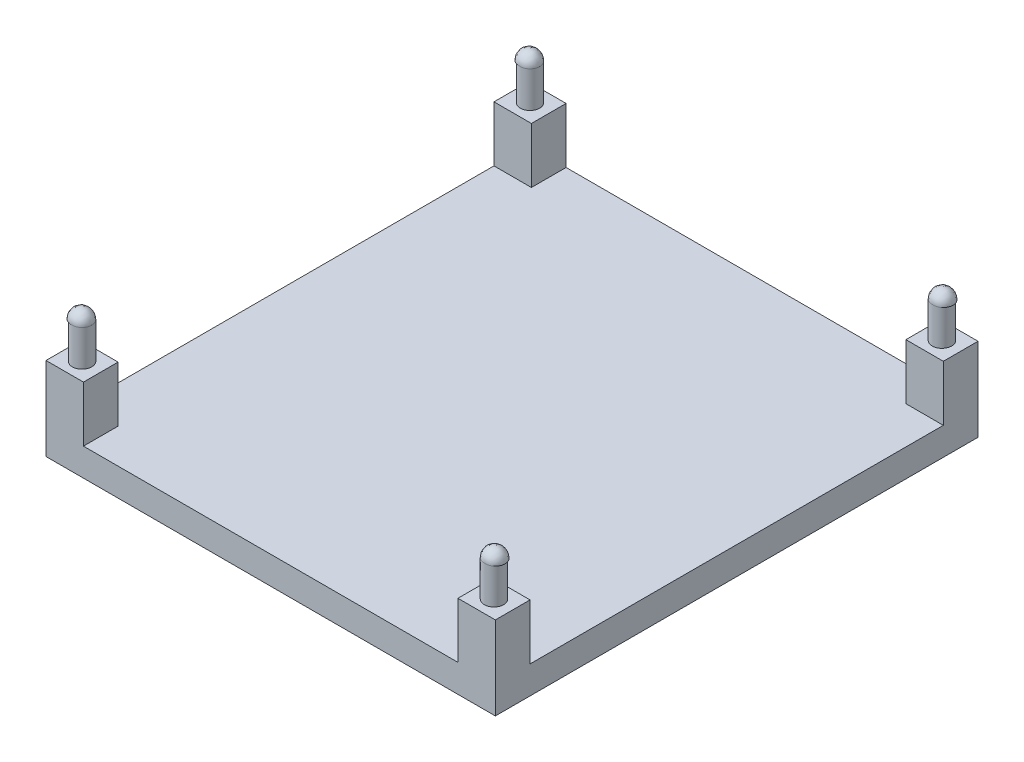
ISO-10303-21;
HEADER;
FILE_DESCRIPTION(('STEP AP214'),'2;1');
FILE_NAME('part.step','',(''),(''),'','','');
FILE_SCHEMA(('AUTOMOTIVE_DESIGN { 1 0 10303 214 1 1 1 1 }'));
ENDSEC;
DATA;
#1=APPLICATION_CONTEXT('core data for automotive mechanical design processes');
#2=APPLICATION_PROTOCOL_DEFINITION('international standard','automotive_design',2000,#1);
#3=PRODUCT_CONTEXT('',#1,'mechanical');
#4=PRODUCT('Part','Part','',(#3));
#5=PRODUCT_RELATED_PRODUCT_CATEGORY('part','',(#4));
#6=PRODUCT_DEFINITION_FORMATION('','',#4);
#7=PRODUCT_DEFINITION_CONTEXT('part definition',#1,'design');
#8=PRODUCT_DEFINITION('design','',#6,#7);
#9=PRODUCT_DEFINITION_SHAPE('','',#8);
#10=(LENGTH_UNIT() NAMED_UNIT(*) SI_UNIT(.MILLI.,.METRE.));
#11=(NAMED_UNIT(*) PLANE_ANGLE_UNIT() SI_UNIT($,.RADIAN.));
#12=(NAMED_UNIT(*) SI_UNIT($,.STERADIAN.) SOLID_ANGLE_UNIT());
#13=UNCERTAINTY_MEASURE_WITH_UNIT(LENGTH_MEASURE(1.E-05),#10,'distance_accuracy_value','');
#14=(GEOMETRIC_REPRESENTATION_CONTEXT(3) GLOBAL_UNCERTAINTY_ASSIGNED_CONTEXT((#13)) GLOBAL_UNIT_ASSIGNED_CONTEXT((#10,
#11,#12)) REPRESENTATION_CONTEXT('',''));
#15=CARTESIAN_POINT('',(0.,0.,0.));
#16=DIRECTION('',(0.,0.,1.));
#17=DIRECTION('',(1.,0.,0.));
#18=AXIS2_PLACEMENT_3D('',#15,#16,#17);
#19=CARTESIAN_POINT('',(0.,5.08,0.));
#20=DIRECTION('',(0.,-1.,0.));
#21=DIRECTION('',(0.,0.,-1.));
#22=AXIS2_PLACEMENT_3D('',#19,#20,#21);
#23=PLANE('',#22);
#24=DIRECTION('',(-1.,0.,0.));
#25=VECTOR('',#24,1.);
#26=CARTESIAN_POINT('',(-34.2899999999991,5.08,37.846));
#27=LINE('',#26,#25);
#28=CARTESIAN_POINT('',(-34.2899999999991,5.08,37.846));
#29=VERTEX_POINT('',#28);
#30=CARTESIAN_POINT('',(-41.148,5.08,37.846));
#31=VERTEX_POINT('',#30);
#32=EDGE_CURVE('E58',#29,#31,#27,.T.);
#33=ORIENTED_EDGE('',*,*,#32,.F.);
#34=DIRECTION('',(0.,0.,-1.));
#35=VECTOR('',#34,1.);
#36=CARTESIAN_POINT('',(-34.2899999999991,5.08,44.1959999999999));
#37=LINE('',#36,#35);
#38=CARTESIAN_POINT('',(-34.2899999999991,5.08,44.196));
#39=VERTEX_POINT('',#38);
#40=EDGE_CURVE('E62',#39,#29,#37,.T.);
#41=ORIENTED_EDGE('',*,*,#40,.F.);
#42=DIRECTION('',(1.,0.,0.));
#43=VECTOR('',#42,1.);
#44=CARTESIAN_POINT('',(-41.148,5.08,44.196));
#45=LINE('',#44,#43);
#46=CARTESIAN_POINT('',(34.2899999999991,5.08,44.1959999999999));
#47=VERTEX_POINT('',#46);
#48=EDGE_CURVE('E409',#39,#47,#45,.T.);
#49=ORIENTED_EDGE('',*,*,#48,.T.);
#50=DIRECTION('',(0.,0.,1.));
#51=VECTOR('',#50,1.);
#52=CARTESIAN_POINT('',(34.2899999999991,5.08,44.1959999999999));
#53=LINE('',#52,#51);
#54=CARTESIAN_POINT('',(34.2899999999991,5.08,37.846));
#55=VERTEX_POINT('',#54);
#56=EDGE_CURVE('E253',#55,#47,#53,.T.);
#57=ORIENTED_EDGE('',*,*,#56,.F.);
#58=DIRECTION('',(-1.,0.,0.));
#59=VECTOR('',#58,1.);
#60=CARTESIAN_POINT('',(34.2899999999991,5.08,37.846));
#61=LINE('',#60,#59);
#62=CARTESIAN_POINT('',(41.1479999999991,5.08,37.846));
#63=VERTEX_POINT('',#62);
#64=EDGE_CURVE('E251',#63,#55,#61,.T.);
#65=ORIENTED_EDGE('',*,*,#64,.F.);
#66=DIRECTION('',(0.,0.,1.));
#67=VECTOR('',#66,1.);
#68=CARTESIAN_POINT('',(41.148,5.08,-44.196));
#69=LINE('',#68,#67);
#70=CARTESIAN_POINT('',(41.148,5.08,-37.846));
#71=VERTEX_POINT('',#70);
#72=EDGE_CURVE('E406',#71,#63,#69,.T.);
#73=ORIENTED_EDGE('',*,*,#72,.F.);
#74=DIRECTION('',(1.,0.,0.));
#75=VECTOR('',#74,1.);
#76=CARTESIAN_POINT('',(34.29,5.08,-37.8460000000001));
#77=LINE('',#76,#75);
#78=CARTESIAN_POINT('',(34.29,5.08,-37.8460000000001));
#79=VERTEX_POINT('',#78);
#80=EDGE_CURVE('E226',#79,#71,#77,.T.);
#81=ORIENTED_EDGE('',*,*,#80,.F.);
#82=DIRECTION('',(0.,0.,1.));
#83=VECTOR('',#82,1.);
#84=CARTESIAN_POINT('',(34.29,5.08,-37.8460000000001));
#85=LINE('',#84,#83);
#86=CARTESIAN_POINT('',(34.29,5.08,-44.196));
#87=VERTEX_POINT('',#86);
#88=EDGE_CURVE('E228',#87,#79,#85,.T.);
#89=ORIENTED_EDGE('',*,*,#88,.F.);
#90=DIRECTION('',(1.,0.,0.));
#91=VECTOR('',#90,1.);
#92=CARTESIAN_POINT('',(-41.148,5.08,-44.196));
#93=LINE('',#92,#91);
#94=CARTESIAN_POINT('',(-34.29,5.08,-44.196));
#95=VERTEX_POINT('',#94);
#96=EDGE_CURVE('E403',#95,#87,#93,.T.);
#97=ORIENTED_EDGE('',*,*,#96,.F.);
#98=DIRECTION('',(0.,0.,-1.));
#99=VECTOR('',#98,1.);
#100=CARTESIAN_POINT('',(-34.29,5.08,-37.8460000000001));
#101=LINE('',#100,#99);
#102=CARTESIAN_POINT('',(-34.29,5.08,-37.8460000000001));
#103=VERTEX_POINT('',#102);
#104=EDGE_CURVE('E270',#103,#95,#101,.T.);
#105=ORIENTED_EDGE('',*,*,#104,.F.);
#106=DIRECTION('',(1.,0.,0.));
#107=VECTOR('',#106,1.);
#108=CARTESIAN_POINT('',(-34.29,5.08,-37.8460000000001));
#109=LINE('',#108,#107);
#110=CARTESIAN_POINT('',(-41.148,5.08,-37.846));
#111=VERTEX_POINT('',#110);
#112=EDGE_CURVE('E257',#111,#103,#109,.T.);
#113=ORIENTED_EDGE('',*,*,#112,.F.);
#114=DIRECTION('',(0.,0.,1.));
#115=VECTOR('',#114,1.);
#116=CARTESIAN_POINT('',(-41.148,5.08,-44.196));
#117=LINE('',#116,#115);
#118=EDGE_CURVE('E411',#111,#31,#117,.T.);
#119=ORIENTED_EDGE('',*,*,#118,.T.);
#120=EDGE_LOOP('',(#33,#41,#49,#57,#65,#73,#81,#89,#97,#105,#113,#119));
#121=FACE_BOUND('',#120,.T.);
#122=ADVANCED_FACE('F41',(#121),#23,.F.);
#123=CARTESIAN_POINT('',(-41.148,5.08,44.196));
#124=DIRECTION('',(0.,0.,-1.));
#125=DIRECTION('',(-1.,0.,0.));
#126=AXIS2_PLACEMENT_3D('',#123,#124,#125);
#127=PLANE('',#126);
#128=DIRECTION('',(1.,0.,0.));
#129=VECTOR('',#128,1.);
#130=CARTESIAN_POINT('',(-41.148,0.,44.196));
#131=LINE('',#130,#129);
#132=CARTESIAN_POINT('',(-41.148,0.,44.196));
#133=VERTEX_POINT('',#132);
#134=CARTESIAN_POINT('',(41.148,0.,44.196));
#135=VERTEX_POINT('',#134);
#136=EDGE_CURVE('E417',#133,#135,#131,.T.);
#137=ORIENTED_EDGE('',*,*,#136,.T.);
#138=DIRECTION('',(0.,-1.,0.));
#139=VECTOR('',#138,1.);
#140=CARTESIAN_POINT('',(41.148,5.08,44.196));
#141=LINE('',#140,#139);
#142=CARTESIAN_POINT('',(41.1479999999991,15.24,44.196));
#143=VERTEX_POINT('',#142);
#144=EDGE_CURVE('E431',#143,#135,#141,.T.);
#145=ORIENTED_EDGE('',*,*,#144,.F.);
#146=DIRECTION('',(1.,0.,0.));
#147=VECTOR('',#146,1.);
#148=CARTESIAN_POINT('',(34.2899999999991,15.24,44.1959999999999));
#149=LINE('',#148,#147);
#150=CARTESIAN_POINT('',(34.2899999999991,15.24,44.1959999999999));
#151=VERTEX_POINT('',#150);
#152=EDGE_CURVE('E261',#151,#143,#149,.T.);
#153=ORIENTED_EDGE('',*,*,#152,.F.);
#154=DIRECTION('',(0.,-1.,0.));
#155=VECTOR('',#154,1.);
#156=CARTESIAN_POINT('',(34.2899999999991,15.24,44.1959999999999));
#157=LINE('',#156,#155);
#158=EDGE_CURVE('E241',#151,#47,#157,.T.);
#159=ORIENTED_EDGE('',*,*,#158,.T.);
#160=ORIENTED_EDGE('',*,*,#48,.F.);
#161=DIRECTION('',(0.,-1.,0.));
#162=VECTOR('',#161,1.);
#163=CARTESIAN_POINT('',(-34.2899999999991,15.24,44.1959999999999));
#164=LINE('',#163,#162);
#165=CARTESIAN_POINT('',(-34.2899999999991,15.24,44.1959999999999));
#166=VERTEX_POINT('',#165);
#167=EDGE_CURVE('E207',#166,#39,#164,.T.);
#168=ORIENTED_EDGE('',*,*,#167,.F.);
#169=DIRECTION('',(1.,0.,0.));
#170=VECTOR('',#169,1.);
#171=CARTESIAN_POINT('',(-34.2899999999991,15.24,44.1959999999999));
#172=LINE('',#171,#170);
#173=CARTESIAN_POINT('',(-41.1479999999992,15.24,44.196));
#174=VERTEX_POINT('',#173);
#175=EDGE_CURVE('E198',#174,#166,#172,.T.);
#176=ORIENTED_EDGE('',*,*,#175,.F.);
#177=DIRECTION('',(0.,-1.,0.));
#178=VECTOR('',#177,1.);
#179=CARTESIAN_POINT('',(-41.148,5.08,44.196));
#180=LINE('',#179,#178);
#181=EDGE_CURVE('E416',#174,#133,#180,.T.);
#182=ORIENTED_EDGE('',*,*,#181,.T.);
#183=EDGE_LOOP('',(#137,#145,#153,#159,#160,#168,#176,#182));
#184=FACE_BOUND('',#183,.T.);
#185=ADVANCED_FACE('F492',(#184),#127,.F.);
#186=CARTESIAN_POINT('',(41.148,5.08,-44.196));
#187=DIRECTION('',(1.,0.,0.));
#188=DIRECTION('',(0.,0.,-1.));
#189=AXIS2_PLACEMENT_3D('',#186,#187,#188);
#190=PLANE('',#189);
#191=DIRECTION('',(0.,0.,1.));
#192=VECTOR('',#191,1.);
#193=CARTESIAN_POINT('',(41.148,0.,-44.196));
#194=LINE('',#193,#192);
#195=CARTESIAN_POINT('',(41.148,0.,-44.196));
#196=VERTEX_POINT('',#195);
#197=EDGE_CURVE('E420',#196,#135,#194,.T.);
#198=ORIENTED_EDGE('',*,*,#197,.F.);
#199=DIRECTION('',(0.,-1.,0.));
#200=VECTOR('',#199,1.);
#201=CARTESIAN_POINT('',(41.148,5.08,-44.196));
#202=LINE('',#201,#200);
#203=CARTESIAN_POINT('',(41.148,15.24,-44.196));
#204=VERTEX_POINT('',#203);
#205=EDGE_CURVE('E397',#204,#196,#202,.T.);
#206=ORIENTED_EDGE('',*,*,#205,.F.);
#207=DIRECTION('',(0.,0.,-1.));
#208=VECTOR('',#207,1.);
#209=CARTESIAN_POINT('',(41.148,15.24,-37.846));
#210=LINE('',#209,#208);
#211=CARTESIAN_POINT('',(41.148,15.24,-37.846));
#212=VERTEX_POINT('',#211);
#213=EDGE_CURVE('E234',#212,#204,#210,.T.);
#214=ORIENTED_EDGE('',*,*,#213,.F.);
#215=DIRECTION('',(0.,-1.,0.));
#216=VECTOR('',#215,1.);
#217=CARTESIAN_POINT('',(41.148,15.24,-37.846));
#218=LINE('',#217,#216);
#219=EDGE_CURVE('E220',#212,#71,#218,.T.);
#220=ORIENTED_EDGE('',*,*,#219,.T.);
#221=ORIENTED_EDGE('',*,*,#72,.T.);
#222=DIRECTION('',(0.,-1.,0.));
#223=VECTOR('',#222,1.);
#224=CARTESIAN_POINT('',(41.1479999999991,15.24,37.846));
#225=LINE('',#224,#223);
#226=CARTESIAN_POINT('',(41.1479999999991,15.24,37.846));
#227=VERTEX_POINT('',#226);
#228=EDGE_CURVE('E244',#227,#63,#225,.T.);
#229=ORIENTED_EDGE('',*,*,#228,.F.);
#230=DIRECTION('',(0.,0.,-1.));
#231=VECTOR('',#230,1.);
#232=CARTESIAN_POINT('',(41.1479999999991,15.24,44.196));
#233=LINE('',#232,#231);
#234=EDGE_CURVE('E259',#143,#227,#233,.T.);
#235=ORIENTED_EDGE('',*,*,#234,.F.);
#236=ORIENTED_EDGE('',*,*,#144,.T.);
#237=EDGE_LOOP('',(#198,#206,#214,#220,#221,#229,#235,#236));
#238=FACE_BOUND('',#237,.T.);
#239=ADVANCED_FACE('F396',(#238),#190,.T.);
#240=CARTESIAN_POINT('',(-41.148,5.08,-44.196));
#241=DIRECTION('',(0.,0.,-1.));
#242=DIRECTION('',(-1.,0.,0.));
#243=AXIS2_PLACEMENT_3D('',#240,#241,#242);
#244=PLANE('',#243);
#245=DIRECTION('',(1.,0.,0.));
#246=VECTOR('',#245,1.);
#247=CARTESIAN_POINT('',(-41.148,0.,-44.196));
#248=LINE('',#247,#246);
#249=CARTESIAN_POINT('',(-41.148,0.,-44.196));
#250=VERTEX_POINT('',#249);
#251=EDGE_CURVE('E423',#250,#196,#248,.T.);
#252=ORIENTED_EDGE('',*,*,#251,.F.);
#253=DIRECTION('',(0.,-1.,0.));
#254=VECTOR('',#253,1.);
#255=CARTESIAN_POINT('',(-41.148,5.08,-44.196));
#256=LINE('',#255,#254);
#257=CARTESIAN_POINT('',(-41.148,15.24,-44.196));
#258=VERTEX_POINT('',#257);
#259=EDGE_CURVE('E429',#258,#250,#256,.T.);
#260=ORIENTED_EDGE('',*,*,#259,.F.);
#261=DIRECTION('',(-1.,0.,0.));
#262=VECTOR('',#261,1.);
#263=CARTESIAN_POINT('',(-34.29,15.24,-44.196));
#264=LINE('',#263,#262);
#265=CARTESIAN_POINT('',(-34.29,15.24,-44.196));
#266=VERTEX_POINT('',#265);
#267=EDGE_CURVE('E274',#266,#258,#264,.T.);
#268=ORIENTED_EDGE('',*,*,#267,.F.);
#269=DIRECTION('',(0.,-1.,0.));
#270=VECTOR('',#269,1.);
#271=CARTESIAN_POINT('',(-34.29,15.24,-44.196));
#272=LINE('',#271,#270);
#273=EDGE_CURVE('E277',#266,#95,#272,.T.);
#274=ORIENTED_EDGE('',*,*,#273,.T.);
#275=ORIENTED_EDGE('',*,*,#96,.T.);
#276=DIRECTION('',(0.,-1.,0.));
#277=VECTOR('',#276,1.);
#278=CARTESIAN_POINT('',(34.29,15.24,-44.196));
#279=LINE('',#278,#277);
#280=CARTESIAN_POINT('',(34.29,15.24,-44.196));
#281=VERTEX_POINT('',#280);
#282=EDGE_CURVE('E223',#281,#87,#279,.T.);
#283=ORIENTED_EDGE('',*,*,#282,.F.);
#284=DIRECTION('',(-1.,0.,0.));
#285=VECTOR('',#284,1.);
#286=CARTESIAN_POINT('',(34.29,15.24,-44.196));
#287=LINE('',#286,#285);
#288=EDGE_CURVE('E225',#204,#281,#287,.T.);
#289=ORIENTED_EDGE('',*,*,#288,.F.);
#290=ORIENTED_EDGE('',*,*,#205,.T.);
#291=EDGE_LOOP('',(#252,#260,#268,#274,#275,#283,#289,#290));
#292=FACE_BOUND('',#291,.T.);
#293=ADVANCED_FACE('F400',(#292),#244,.T.);
#294=CARTESIAN_POINT('',(-41.148,5.08,-44.196));
#295=DIRECTION('',(1.,0.,0.));
#296=DIRECTION('',(0.,0.,-1.));
#297=AXIS2_PLACEMENT_3D('',#294,#295,#296);
#298=PLANE('',#297);
#299=DIRECTION('',(0.,0.,1.));
#300=VECTOR('',#299,1.);
#301=CARTESIAN_POINT('',(-41.148,0.,-44.196));
#302=LINE('',#301,#300);
#303=EDGE_CURVE('E413',#250,#133,#302,.T.);
#304=ORIENTED_EDGE('',*,*,#303,.T.);
#305=ORIENTED_EDGE('',*,*,#181,.F.);
#306=DIRECTION('',(0.,0.,1.));
#307=VECTOR('',#306,1.);
#308=CARTESIAN_POINT('',(-41.1479999999992,15.24,44.196));
#309=LINE('',#308,#307);
#310=CARTESIAN_POINT('',(-41.1479999999992,15.24,37.846));
#311=VERTEX_POINT('',#310);
#312=EDGE_CURVE('E212',#311,#174,#309,.T.);
#313=ORIENTED_EDGE('',*,*,#312,.F.);
#314=DIRECTION('',(0.,-1.,0.));
#315=VECTOR('',#314,1.);
#316=CARTESIAN_POINT('',(-41.1479999999992,15.24,37.846));
#317=LINE('',#316,#315);
#318=EDGE_CURVE('E211',#311,#31,#317,.T.);
#319=ORIENTED_EDGE('',*,*,#318,.T.);
#320=ORIENTED_EDGE('',*,*,#118,.F.);
#321=DIRECTION('',(0.,-1.,0.));
#322=VECTOR('',#321,1.);
#323=CARTESIAN_POINT('',(-41.148,15.24,-37.846));
#324=LINE('',#323,#322);
#325=CARTESIAN_POINT('',(-41.148,15.24,-37.846));
#326=VERTEX_POINT('',#325);
#327=EDGE_CURVE('E285',#326,#111,#324,.T.);
#328=ORIENTED_EDGE('',*,*,#327,.F.);
#329=DIRECTION('',(0.,0.,1.));
#330=VECTOR('',#329,1.);
#331=CARTESIAN_POINT('',(-41.148,15.24,-37.846));
#332=LINE('',#331,#330);
#333=EDGE_CURVE('E266',#258,#326,#332,.T.);
#334=ORIENTED_EDGE('',*,*,#333,.F.);
#335=ORIENTED_EDGE('',*,*,#259,.T.);
#336=EDGE_LOOP('',(#304,#305,#313,#319,#320,#328,#334,#335));
#337=FACE_BOUND('',#336,.T.);
#338=ADVANCED_FACE('F489',(#337),#298,.F.);
#339=CARTESIAN_POINT('',(37.719,0.,-41.021));
#340=DIRECTION('',(0.,-1.,0.));
#341=DIRECTION('',(0.,0.,-1.));
#342=AXIS2_PLACEMENT_3D('',#339,#340,#341);
#343=PLANE('',#342);
#344=ORIENTED_EDGE('',*,*,#136,.F.);
#345=ORIENTED_EDGE('',*,*,#303,.F.);
#346=ORIENTED_EDGE('',*,*,#251,.T.);
#347=ORIENTED_EDGE('',*,*,#197,.T.);
#348=EDGE_LOOP('',(#344,#345,#346,#347));
#349=FACE_BOUND('',#348,.T.);
#350=ADVANCED_FACE('F505',(#349),#343,.T.);
#351=CARTESIAN_POINT('',(-34.29,15.24,-37.8460000000001));
#352=DIRECTION('',(0.,0.,-1.));
#353=DIRECTION('',(-1.,0.,0.));
#354=AXIS2_PLACEMENT_3D('',#351,#352,#353);
#355=PLANE('',#354);
#356=ORIENTED_EDGE('',*,*,#112,.T.);
#357=DIRECTION('',(0.,-1.,0.));
#358=VECTOR('',#357,1.);
#359=CARTESIAN_POINT('',(-34.29,15.24,-37.8460000000001));
#360=LINE('',#359,#358);
#361=CARTESIAN_POINT('',(-34.29,15.24,-37.8460000000001));
#362=VERTEX_POINT('',#361);
#363=EDGE_CURVE('E282',#362,#103,#360,.T.);
#364=ORIENTED_EDGE('',*,*,#363,.F.);
#365=DIRECTION('',(1.,0.,0.));
#366=VECTOR('',#365,1.);
#367=CARTESIAN_POINT('',(-34.29,15.24,-37.8460000000001));
#368=LINE('',#367,#366);
#369=EDGE_CURVE('E269',#326,#362,#368,.T.);
#370=ORIENTED_EDGE('',*,*,#369,.F.);
#371=ORIENTED_EDGE('',*,*,#327,.T.);
#372=EDGE_LOOP('',(#356,#364,#370,#371));
#373=FACE_BOUND('',#372,.T.);
#374=ADVANCED_FACE('F513',(#373),#355,.F.);
#375=CARTESIAN_POINT('',(-34.29,15.24,-37.8460000000001));
#376=DIRECTION('',(-1.,0.,0.));
#377=DIRECTION('',(0.,0.,1.));
#378=AXIS2_PLACEMENT_3D('',#375,#376,#377);
#379=PLANE('',#378);
#380=ORIENTED_EDGE('',*,*,#104,.T.);
#381=ORIENTED_EDGE('',*,*,#273,.F.);
#382=DIRECTION('',(0.,0.,-1.));
#383=VECTOR('',#382,1.);
#384=CARTESIAN_POINT('',(-34.29,15.24,-37.8460000000001));
#385=LINE('',#384,#383);
#386=EDGE_CURVE('E272',#362,#266,#385,.T.);
#387=ORIENTED_EDGE('',*,*,#386,.F.);
#388=ORIENTED_EDGE('',*,*,#363,.T.);
#389=EDGE_LOOP('',(#380,#381,#387,#388));
#390=FACE_BOUND('',#389,.T.);
#391=ADVANCED_FACE('F516',(#390),#379,.F.);
#392=CARTESIAN_POINT('',(0.,15.24,0.));
#393=DIRECTION('',(0.,1.,0.));
#394=DIRECTION('',(0.,0.,1.));
#395=AXIS2_PLACEMENT_3D('',#392,#393,#394);
#396=PLANE('',#395);
#397=CARTESIAN_POINT('',(-37.719,15.24,-41.021));
#398=DIRECTION('',(0.,1.,0.));
#399=DIRECTION('',(0.,0.,1.));
#400=AXIS2_PLACEMENT_3D('',#397,#398,#399);
#401=CIRCLE('',#400,1.778);
#402=CARTESIAN_POINT('',(-37.719,15.24,-39.243));
#403=VERTEX_POINT('',#402);
#404=EDGE_CURVE('E287',#403,#403,#401,.T.);
#405=ORIENTED_EDGE('',*,*,#404,.F.);
#406=EDGE_LOOP('',(#405));
#407=FACE_BOUND('',#406,.T.);
#408=ORIENTED_EDGE('',*,*,#333,.T.);
#409=ORIENTED_EDGE('',*,*,#369,.T.);
#410=ORIENTED_EDGE('',*,*,#386,.T.);
#411=ORIENTED_EDGE('',*,*,#267,.T.);
#412=EDGE_LOOP('',(#408,#409,#410,#411));
#413=FACE_BOUND('',#412,.T.);
#414=ADVANCED_FACE('F459',(#407,#413),#396,.T.);
#415=CARTESIAN_POINT('',(-37.973,21.844,-41.021));
#416=DIRECTION('',(0.,-1.,0.));
#417=DIRECTION('',(-1.,0.,0.));
#418=AXIS2_PLACEMENT_3D('',#415,#416,#417);
#419=CIRCLE('',#418,1.778);
#420=TRIMMED_CURVE('',#419,(PARAMETER_VALUE(-1.6421037915802)),
(PARAMETER_VALUE(1.6421037915802)),.T.,.PARAMETER.);
#421=CARTESIAN_POINT('',(-37.8463227451215,21.844,-41.021));
#422=DIRECTION('',(0.,0.,-1.));
#423=AXIS1_PLACEMENT('',#421,#422);
#424=SURFACE_OF_REVOLUTION('',#420,#423);
#425=CARTESIAN_POINT('',(-37.719645490243,21.844,-41.021));
#426=DIRECTION('',(0.,1.,0.));
#427=DIRECTION('',(0.,0.,-1.));
#428=AXIS2_PLACEMENT_3D('',#425,#426,#427);
#429=CIRCLE('',#428,1.778);
#430=CARTESIAN_POINT('',(-37.8463227451215,21.844,-39.247518431701));
#431=VERTEX_POINT('',#430);
#432=CARTESIAN_POINT('',(-37.719322745097,21.844,-39.2430000292926));
#433=VERTEX_POINT('',#432);
#434=EDGE_CURVE('E294',#431,#433,#429,.T.);
#435=ORIENTED_EDGE('',*,*,#434,.T.);
#436=CARTESIAN_POINT('',(-37.719322745097,21.844,-39.2430000292926));
#437=CARTESIAN_POINT('',(-37.6902336210618,21.844,-39.243004692754));
#438=CARTESIAN_POINT('',(-37.6611446793104,21.844,-39.2437244392145));
#439=CARTESIAN_POINT('',(-37.6030370884671,21.844,-39.2465896563699));
#440=CARTESIAN_POINT('',(-37.5740184393753,21.844,-39.2487351270648));
#441=CARTESIAN_POINT('',(-37.5161213619432,21.844,-39.2544473509251));
#442=CARTESIAN_POINT('',(-37.487242933603,21.844,-39.2580141040905));
#443=CARTESIAN_POINT('',(-37.4296958426758,21.844,-39.266560107814));
#444=CARTESIAN_POINT('',(-37.4010271800889,21.844,-39.2715393583721));
#445=CARTESIAN_POINT('',(-37.3439686725981,21.844,-39.2828984163028));
#446=CARTESIAN_POINT('',(-37.3155788276941,21.844,-39.2892782236753));
#447=CARTESIAN_POINT('',(-37.259146332701,21.844,-39.303423015311));
#448=CARTESIAN_POINT('',(-37.2311036826117,21.844,-39.3111879995741));
#449=CARTESIAN_POINT('',(-37.1754331190228,21.844,-39.3280844465267));
#450=CARTESIAN_POINT('',(-37.1478052055232,21.844,-39.3372159092162));
#451=CARTESIAN_POINT('',(-37.0930306577487,21.844,-39.3568233186087));
#452=CARTESIAN_POINT('',(-37.0658840234739,21.844,-39.3672992653118));
#453=CARTESIAN_POINT('',(-37.012137417671,21.844,-39.3895704113583));
#454=CARTESIAN_POINT('',(-36.9855374461429,21.844,-39.4013656107017));
#455=CARTESIAN_POINT('',(-36.9329482326844,21.844,-39.4262468528543));
#456=CARTESIAN_POINT('',(-36.906958990754,21.844,-39.4393328956635));
#457=CARTESIAN_POINT('',(-36.8556538323854,21.844,-39.4667643066279));
#458=CARTESIAN_POINT('',(-36.8303379159471,21.844,-39.4811096747831));
#459=CARTESIAN_POINT('',(-36.7804403827305,21.844,-39.5110251851712));
#460=CARTESIAN_POINT('',(-36.7558587659522,21.844,-39.5265953274041));
#461=CARTESIAN_POINT('',(-36.7074890376403,21.844,-39.5589228847797));
#462=CARTESIAN_POINT('',(-36.6837009261068,21.844,-39.5756802999224));
#463=CARTESIAN_POINT('',(-36.6369755026871,21.844,-39.6103420423642));
#464=CARTESIAN_POINT('',(-36.6140381908009,21.844,-39.6282463696633));
#465=CARTESIAN_POINT('',(-36.5690696119016,21.844,-39.6651588132917));
#466=CARTESIAN_POINT('',(-36.5470383448884,21.844,-39.684166929621));
#467=CARTESIAN_POINT('',(-36.5039349187232,21.844,-39.7232411696733));
#468=CARTESIAN_POINT('',(-36.4828627595713,21.844,-39.7433072933964));
#469=CARTESIAN_POINT('',(-36.441728302076,21.844,-39.7844492183565));
#470=CARTESIAN_POINT('',(-36.4216660037327,21.844,-39.8055250195935));
#471=CARTESIAN_POINT('',(-36.3825995885212,21.844,-39.8486355378618));
#472=CARTESIAN_POINT('',(-36.3635954716529,21.844,-39.8706702548932));
#473=CARTESIAN_POINT('',(-36.3266911913949,21.844,-39.9156455334525));
#474=CARTESIAN_POINT('',(-36.3087910280053,21.844,-39.9385860949805));
#475=CARTESIAN_POINT('',(-36.2741377678019,21.844,-39.9853178094806));
#476=CARTESIAN_POINT('',(-36.2573846709882,21.844,-40.0091089624529));
#477=CARTESIAN_POINT('',(-36.225065894289,21.844,-40.0574845581134));
#478=CARTESIAN_POINT('',(-36.2095002144035,21.844,-40.0820690008018));
#479=CARTESIAN_POINT('',(-36.1795937619822,21.844,-40.1319719635036));
#480=CARTESIAN_POINT('',(-36.1652529894464,21.844,-40.1572904835171));
#481=CARTESIAN_POINT('',(-36.1378308919191,21.844,-40.2086006204302));
#482=CARTESIAN_POINT('',(-36.1247495669276,21.844,-40.23459223733));
#483=CARTESIAN_POINT('',(-36.0998778712648,21.844,-40.287185966402));
#484=CARTESIAN_POINT('',(-36.0880875005935,21.844,-40.3137880785743));
#485=CARTESIAN_POINT('',(-36.0658261110438,21.844,-40.3675387261812));
#486=CARTESIAN_POINT('',(-36.0553550921653,21.844,-40.3946872616158));
#487=CARTESIAN_POINT('',(-36.0357576259743,21.844,-40.4494653676596));
#488=CARTESIAN_POINT('',(-36.0266311786617,21.844,-40.4770949382687));
#489=CARTESIAN_POINT('',(-36.0097448369332,21.844,-40.5327685679858));
#490=CARTESIAN_POINT('',(-36.0019849425173,21.844,-40.5608126270937));
#491=CARTESIAN_POINT('',(-35.9878503965278,21.844,-40.6172476888242));
#492=CARTESIAN_POINT('',(-35.9814757449543,21.844,-40.6456386914467));
#493=CARTESIAN_POINT('',(-35.9701270381953,21.844,-40.7026992595979));
#494=CARTESIAN_POINT('',(-35.9651529830098,21.844,-40.7313688251267));
#495=CARTESIAN_POINT('',(-35.9566174491927,21.844,-40.7889174675547));
#496=CARTESIAN_POINT('',(-35.9530559705611,21.844,-40.8177965444539));
#497=CARTESIAN_POINT('',(-35.9473541677832,21.844,-40.8756946534725));
#498=CARTESIAN_POINT('',(-35.9452138436369,21.844,-40.9047136855919));
#499=CARTESIAN_POINT('',(-35.9423595048666,21.844,-40.9628218118139));
#500=CARTESIAN_POINT('',(-35.9416454902426,21.844,-40.9919109059165));
#501=CARTESIAN_POINT('',(-35.9416454902433,21.844,-41.0500890941218));
#502=CARTESIAN_POINT('',(-35.9423595048679,21.844,-41.0791781882244));
#503=CARTESIAN_POINT('',(-35.9452138436394,21.844,-41.1372863144463));
#504=CARTESIAN_POINT('',(-35.9473541677863,21.844,-41.1663053465656));
#505=CARTESIAN_POINT('',(-35.9530559705654,21.844,-41.2242034555841));
#506=CARTESIAN_POINT('',(-35.9566174491977,21.844,-41.2530825324833));
#507=CARTESIAN_POINT('',(-35.965152983016,21.844,-41.3106311749111));
#508=CARTESIAN_POINT('',(-35.9701270382021,21.844,-41.3393007404397));
#509=CARTESIAN_POINT('',(-35.9814757449624,21.844,-41.3963613085907));
#510=CARTESIAN_POINT('',(-35.9878503965365,21.844,-41.4247523112131));
#511=CARTESIAN_POINT('',(-36.0019849425272,21.844,-41.4811873729433));
#512=CARTESIAN_POINT('',(-36.0097448369437,21.844,-41.509231432051));
#513=CARTESIAN_POINT('',(-36.0266311786734,21.844,-41.5649050617677));
#514=CARTESIAN_POINT('',(-36.0357576259866,21.844,-41.5925346323767));
#515=CARTESIAN_POINT('',(-36.0553550921788,21.844,-41.64731273842));
#516=CARTESIAN_POINT('',(-36.0658261110578,21.844,-41.6744612738544));
#517=CARTESIAN_POINT('',(-36.0880875006087,21.844,-41.7282119214608));
#518=CARTESIAN_POINT('',(-36.0998778712805,21.844,-41.7548140336329));
#519=CARTESIAN_POINT('',(-36.1247495669445,21.844,-41.8074077627044));
#520=CARTESIAN_POINT('',(-36.1378308919366,21.844,-41.8333993796038));
#521=CARTESIAN_POINT('',(-36.165252989465,21.844,-41.8847095165164));
#522=CARTESIAN_POINT('',(-36.1795937620013,21.844,-41.9100280365296));
#523=CARTESIAN_POINT('',(-36.2095002144237,21.844,-41.9599309992307));
#524=CARTESIAN_POINT('',(-36.2250658943097,21.844,-41.9845154419188));
#525=CARTESIAN_POINT('',(-36.25738467101,21.844,-42.0328910375786));
#526=CARTESIAN_POINT('',(-36.2741377678242,21.844,-42.0566821905505));
#527=CARTESIAN_POINT('',(-36.3087910280285,21.844,-42.1034139050499));
#528=CARTESIAN_POINT('',(-36.3266911914187,21.844,-42.1263544665775));
#529=CARTESIAN_POINT('',(-36.3635954716776,21.844,-42.171329745136));
#530=CARTESIAN_POINT('',(-36.3825995885464,21.844,-42.193364462167));
#531=CARTESIAN_POINT('',(-36.4216660037588,21.844,-42.2364749804345));
#532=CARTESIAN_POINT('',(-36.4417283021026,21.844,-42.257550781671));
#533=CARTESIAN_POINT('',(-36.4828627595987,21.844,-42.2986927066302));
#534=CARTESIAN_POINT('',(-36.5039349187511,21.844,-42.3187588303528));
#535=CARTESIAN_POINT('',(-36.5470383449171,21.844,-42.3578330704043));
#536=CARTESIAN_POINT('',(-36.5690696119307,21.844,-42.3768411867331));
#537=CARTESIAN_POINT('',(-36.6140381908309,21.844,-42.4137536303606));
#538=CARTESIAN_POINT('',(-36.6369755027174,21.844,-42.4316579576592));
#539=CARTESIAN_POINT('',(-36.6837009261378,21.844,-42.4663197000999));
#540=CARTESIAN_POINT('',(-36.7074890376718,21.844,-42.4830771152421));
#541=CARTESIAN_POINT('',(-36.7558587659843,21.844,-42.5154046726166));
#542=CARTESIAN_POINT('',(-36.780440382763,21.844,-42.530974814849));
#543=CARTESIAN_POINT('',(-36.8303379159802,21.844,-42.5608903252361));
#544=CARTESIAN_POINT('',(-36.8556538324188,21.844,-42.5752356933907));
#545=CARTESIAN_POINT('',(-36.906958990788,21.844,-42.602667104354));
#546=CARTESIAN_POINT('',(-36.9329482327187,21.844,-42.6157531471627));
#547=CARTESIAN_POINT('',(-36.9855374461777,21.844,-42.6406343893141));
#548=CARTESIAN_POINT('',(-37.0121374177061,21.844,-42.652429588657));
#549=CARTESIAN_POINT('',(-37.0658840235095,21.844,-42.6747007347023));
#550=CARTESIAN_POINT('',(-37.0930306577845,21.844,-42.6851766814048));
#551=CARTESIAN_POINT('',(-37.1478052055594,21.844,-42.7047840907962));
#552=CARTESIAN_POINT('',(-37.1754331190592,21.844,-42.713915553485));
#553=CARTESIAN_POINT('',(-37.2311036826485,21.844,-42.7308120004364));
#554=CARTESIAN_POINT('',(-37.2591463327379,21.844,-42.738576984699));
#555=CARTESIAN_POINT('',(-37.3155788277314,21.844,-42.7527217763334));
#556=CARTESIAN_POINT('',(-37.3439686726354,21.844,-42.7591015837053));
#557=CARTESIAN_POINT('',(-37.4010271801265,21.844,-42.7704606416348));
#558=CARTESIAN_POINT('',(-37.4296958427135,21.844,-42.7754398921923));
#559=CARTESIAN_POINT('',(-37.4872429336409,21.844,-42.7839858959146));
#560=CARTESIAN_POINT('',(-37.5161213619812,21.844,-42.7875526490793));
#561=CARTESIAN_POINT('',(-37.5740184394133,21.844,-42.7932648729384));
#562=CARTESIAN_POINT('',(-37.6030370885052,21.844,-42.7954103436326));
#563=CARTESIAN_POINT('',(-37.6611446793486,21.844,-42.7982755607868));
#564=CARTESIAN_POINT('',(-37.6902336211,21.844,-42.7989953072467));
#565=CARTESIAN_POINT('',(-37.7193227451352,21.844,-42.7989999707074));
#566=B_SPLINE_CURVE_WITH_KNOTS('',3,(#436,#437,#438,#439,#440,#441,#442,#443,#444,#445,#446,
#447,#448,#449,#450,#451,#452,#453,#454,#455,#456,#457,#458,#459,#460,#461,#462,#463,#464,#465,
#466,#467,#468,#469,#470,#471,#472,#473,#474,#475,#476,#477,#478,#479,#480,#481,#482,#483,#484,
#485,#486,#487,#488,#489,#490,#491,#492,#493,#494,#495,#496,#497,#498,#499,#500,#501,#502,#503,
#504,#505,#506,#507,#508,#509,#510,#511,#512,#513,#514,#515,#516,#517,#518,#519,#520,#521,#522,
#523,#524,#525,#526,#527,#528,#529,#530,#531,#532,#533,#534,#535,#536,#537,#538,#539,#540,#541,
#542,#543,#544,#545,#546,#547,#548,#549,#550,#551,#552,#553,#554,#555,#556,#557,#558,#559,#560,
#561,#562,#563,#564,#565),.UNSPECIFIED.,.F.,.F.,(4,2,2,2,2,2,2,2,2,2,2,2,2,2,2,2,2,2,2,2,2,2,2,
2,2,2,2,2,2,2,2,2,2,2,2,2,2,2,2,2,2,2,2,2,2,2,2,2,2,2,2,2,2,2,2,2,2,2,2,2,2,2,2,2,4),(0.,
0.0872585258795057,0.174517051759012,0.261775577638514,0.349034103518023,0.436292629397526,
0.523551155277038,0.610809681156539,0.698068207036046,0.785326732915551,0.872585258795059,
0.959843784674559,1.04710231055407,1.13436083643357,1.22161936231308,1.30887788819258,
1.39613641407209,1.4833949399516,1.5706534658311,1.65791199171061,1.74517051759012,
1.83242904346962,1.91968756934913,2.00694609522863,2.09420462110813,2.18146314698764,
2.26872167286715,2.35598019874665,2.44323872462616,2.53049725050567,2.61775577638517,
2.70501430226468,2.79227282814418,2.87953135402369,2.96678987990319,3.0540484057827,
3.1413069316622,3.22856545754172,3.31582398342122,3.40308250930073,3.49034103518023,
3.57759956105973,3.66485808693924,3.75211661281875,3.83937513869825,3.92663366457776,
4.01389219045727,4.10115071633677,4.18840924221628,4.27566776809578,4.36292629397529,
4.45018481985479,4.5374433457343,4.62470187161381,4.71196039749331,4.79921892337282,
4.88647744925233,4.97373597513183,5.06099450101133,5.14825302689084,5.23551155277034,
5.32277007864985,5.41002860452935,5.49728713040886,5.58454565628837),.UNSPECIFIED.);
#567=CARTESIAN_POINT('',(-37.7193227451352,21.844,-42.7989999707074));
#568=VERTEX_POINT('',#567);
#569=EDGE_CURVE('E50',#433,#568,#566,.T.);
#570=ORIENTED_EDGE('',*,*,#569,.T.);
#571=CARTESIAN_POINT('',(-37.8463227451215,21.844,-42.7944815682991));
#572=VERTEX_POINT('',#571);
#573=EDGE_CURVE('E297',#568,#572,#429,.T.);
#574=ORIENTED_EDGE('',*,*,#573,.T.);
#575=CARTESIAN_POINT('',(-37.973,21.844,-41.021));
#576=DIRECTION('',(0.,-1.,0.));
#577=DIRECTION('',(0.,0.,-1.));
#578=AXIS2_PLACEMENT_3D('',#575,#576,#577);
#579=CIRCLE('',#578,1.778);
#580=EDGE_CURVE('E290',#431,#572,#579,.T.);
#581=ORIENTED_EDGE('',*,*,#580,.F.);
#582=EDGE_LOOP('',(#435,#570,#574,#581));
#583=FACE_BOUND('',#582,.T.);
#584=ADVANCED_FACE('F441',(#583),#424,.T.);
#585=CARTESIAN_POINT('',(-37.973,21.844,-41.021));
#586=DIRECTION('',(0.,1.,0.));
#587=DIRECTION('',(0.,0.,-1.));
#588=AXIS2_PLACEMENT_3D('',#585,#586,#587);
#589=PLANE('',#588);
#590=ORIENTED_EDGE('',*,*,#573,.F.);
#591=CARTESIAN_POINT('',(-37.719,21.844,-41.021));
#592=DIRECTION('',(0.,1.,0.));
#593=DIRECTION('',(0.,0.,1.));
#594=AXIS2_PLACEMENT_3D('',#591,#592,#593);
#595=CIRCLE('',#594,1.778);
#596=EDGE_CURVE('E328',#568,#433,#595,.T.);
#597=ORIENTED_EDGE('',*,*,#596,.T.);
#598=ORIENTED_EDGE('',*,*,#434,.F.);
#599=ORIENTED_EDGE('',*,*,#580,.T.);
#600=EDGE_LOOP('',(#590,#597,#598,#599));
#601=FACE_BOUND('',#600,.T.);
#602=ADVANCED_FACE('F359',(#601),#589,.F.);
#603=CARTESIAN_POINT('',(-37.719,21.844,-41.021));
#604=DIRECTION('',(0.,-1.,0.));
#605=DIRECTION('',(0.,0.,-1.));
#606=AXIS2_PLACEMENT_3D('',#603,#604,#605);
#607=CYLINDRICAL_SURFACE('',#606,1.778);
#608=ORIENTED_EDGE('',*,*,#404,.T.);
#609=EDGE_LOOP('',(#608));
#610=FACE_BOUND('',#609,.T.);
#611=ORIENTED_EDGE('',*,*,#596,.F.);
#612=ORIENTED_EDGE('',*,*,#569,.F.);
#613=EDGE_LOOP('',(#611,#612));
#614=FACE_BOUND('',#613,.T.);
#615=ADVANCED_FACE('F354',(#610,#614),#607,.T.);
#616=CARTESIAN_POINT('',(34.2899999999991,15.24,44.1959999999999));
#617=DIRECTION('',(1.,0.,0.));
#618=DIRECTION('',(0.,0.,-1.));
#619=AXIS2_PLACEMENT_3D('',#616,#617,#618);
#620=PLANE('',#619);
#621=ORIENTED_EDGE('',*,*,#56,.T.);
#622=ORIENTED_EDGE('',*,*,#158,.F.);
#623=DIRECTION('',(0.,0.,1.));
#624=VECTOR('',#623,1.);
#625=CARTESIAN_POINT('',(34.2899999999991,15.24,44.1959999999999));
#626=LINE('',#625,#624);
#627=CARTESIAN_POINT('',(34.2899999999991,15.24,37.846));
#628=VERTEX_POINT('',#627);
#629=EDGE_CURVE('E254',#628,#151,#626,.T.);
#630=ORIENTED_EDGE('',*,*,#629,.F.);
#631=DIRECTION('',(0.,-1.,0.));
#632=VECTOR('',#631,1.);
#633=CARTESIAN_POINT('',(34.2899999999991,15.24,37.846));
#634=LINE('',#633,#632);
#635=EDGE_CURVE('E247',#628,#55,#634,.T.);
#636=ORIENTED_EDGE('',*,*,#635,.T.);
#637=EDGE_LOOP('',(#621,#622,#630,#636));
#638=FACE_BOUND('',#637,.T.);
#639=ADVANCED_FACE('F358',(#638),#620,.F.);
#640=CARTESIAN_POINT('',(34.2899999999991,15.24,37.846));
#641=DIRECTION('',(0.,0.,1.));
#642=DIRECTION('',(1.,0.,0.));
#643=AXIS2_PLACEMENT_3D('',#640,#641,#642);
#644=PLANE('',#643);
#645=ORIENTED_EDGE('',*,*,#64,.T.);
#646=ORIENTED_EDGE('',*,*,#635,.F.);
#647=DIRECTION('',(-1.,0.,0.));
#648=VECTOR('',#647,1.);
#649=CARTESIAN_POINT('',(34.2899999999991,15.24,37.846));
#650=LINE('',#649,#648);
#651=EDGE_CURVE('E250',#227,#628,#650,.T.);
#652=ORIENTED_EDGE('',*,*,#651,.F.);
#653=ORIENTED_EDGE('',*,*,#228,.T.);
#654=EDGE_LOOP('',(#645,#646,#652,#653));
#655=FACE_BOUND('',#654,.T.);
#656=ADVANCED_FACE('F500',(#655),#644,.F.);
#657=CARTESIAN_POINT('',(0.,15.24,0.));
#658=DIRECTION('',(0.,-1.,0.));
#659=DIRECTION('',(0.,0.,-1.));
#660=AXIS2_PLACEMENT_3D('',#657,#658,#659);
#661=PLANE('',#660);
#662=CARTESIAN_POINT('',(37.719,15.24,41.021));
#663=DIRECTION('',(0.,-1.,0.));
#664=DIRECTION('',(0.,0.,-1.));
#665=AXIS2_PLACEMENT_3D('',#662,#663,#664);
#666=CIRCLE('',#665,1.778);
#667=CARTESIAN_POINT('',(37.719,15.24,39.243));
#668=VERTEX_POINT('',#667);
#669=EDGE_CURVE('E11',#668,#668,#666,.T.);
#670=ORIENTED_EDGE('',*,*,#669,.T.);
#671=EDGE_LOOP('',(#670));
#672=FACE_BOUND('',#671,.T.);
#673=ORIENTED_EDGE('',*,*,#629,.T.);
#674=ORIENTED_EDGE('',*,*,#152,.T.);
#675=ORIENTED_EDGE('',*,*,#234,.T.);
#676=ORIENTED_EDGE('',*,*,#651,.T.);
#677=EDGE_LOOP('',(#673,#674,#675,#676));
#678=FACE_BOUND('',#677,.T.);
#679=ADVANCED_FACE('F502',(#672,#678),#661,.F.);
#680=CARTESIAN_POINT('',(37.719,21.844,41.021));
#681=DIRECTION('',(0.,1.,0.));
#682=DIRECTION('',(0.,0.,-1.));
#683=AXIS2_PLACEMENT_3D('',#680,#681,#682);
#684=PLANE('',#683);
#685=CARTESIAN_POINT('',(37.972354509757,21.844,41.021));
#686=DIRECTION('',(0.,1.,0.));
#687=DIRECTION('',(0.,0.,-1.));
#688=AXIS2_PLACEMENT_3D('',#685,#686,#687);
#689=CIRCLE('',#688,1.778);
#690=CARTESIAN_POINT('',(37.8456772548785,21.844,42.794481568299));
#691=VERTEX_POINT('',#690);
#692=CARTESIAN_POINT('',(37.8456772548785,21.844,39.2475184317009));
#693=VERTEX_POINT('',#692);
#694=EDGE_CURVE('E312',#691,#693,#689,.T.);
#695=ORIENTED_EDGE('',*,*,#694,.F.);
#696=CARTESIAN_POINT('',(37.719,21.844,41.021));
#697=DIRECTION('',(0.,1.,0.));
#698=DIRECTION('',(0.,0.,1.));
#699=AXIS2_PLACEMENT_3D('',#696,#697,#698);
#700=CIRCLE('',#699,1.778);
#701=EDGE_CURVE('E315',#691,#693,#700,.T.);
#702=ORIENTED_EDGE('',*,*,#701,.T.);
#703=EDGE_LOOP('',(#695,#702));
#704=FACE_BOUND('',#703,.T.);
#705=ADVANCED_FACE('F585',(#704),#684,.F.);
#706=CARTESIAN_POINT('',(37.719,21.844,41.021));
#707=DIRECTION('',(0.,-1.,0.));
#708=DIRECTION('',(-1.,0.,0.));
#709=AXIS2_PLACEMENT_3D('',#706,#707,#708);
#710=CIRCLE('',#709,1.778);
#711=TRIMMED_CURVE('',#710,(PARAMETER_VALUE(-1.6421037915802)),
(PARAMETER_VALUE(1.6421037915802)),.T.,.PARAMETER.);
#712=CARTESIAN_POINT('',(37.8456772548785,21.844,41.021));
#713=DIRECTION('',(0.,0.,-1.));
#714=AXIS1_PLACEMENT('',#712,#713);
#715=SURFACE_OF_REVOLUTION('',#711,#714);
#716=ORIENTED_EDGE('',*,*,#694,.T.);
#717=EDGE_CURVE('E316',#693,#691,#700,.T.);
#718=ORIENTED_EDGE('',*,*,#717,.T.);
#719=EDGE_LOOP('',(#716,#718));
#720=FACE_BOUND('',#719,.T.);
#721=ADVANCED_FACE('F589',(#720),#715,.T.);
#722=CARTESIAN_POINT('',(37.719,21.844,41.021));
#723=DIRECTION('',(0.,-1.,0.));
#724=DIRECTION('',(0.,0.,-1.));
#725=AXIS2_PLACEMENT_3D('',#722,#723,#724);
#726=CYLINDRICAL_SURFACE('',#725,1.778);
#727=ORIENTED_EDGE('',*,*,#717,.F.);
#728=ORIENTED_EDGE('',*,*,#701,.F.);
#729=EDGE_LOOP('',(#727,#728));
#730=FACE_BOUND('',#729,.T.);
#731=ORIENTED_EDGE('',*,*,#669,.F.);
#732=EDGE_LOOP('',(#731));
#733=FACE_BOUND('',#732,.T.);
#734=ADVANCED_FACE('F352',(#730,#733),#726,.T.);
#735=CARTESIAN_POINT('',(34.29,15.24,-37.8460000000001));
#736=DIRECTION('',(1.,0.,0.));
#737=DIRECTION('',(0.,0.,-1.));
#738=AXIS2_PLACEMENT_3D('',#735,#736,#737);
#739=PLANE('',#738);
#740=ORIENTED_EDGE('',*,*,#88,.T.);
#741=DIRECTION('',(0.,-1.,0.));
#742=VECTOR('',#741,1.);
#743=CARTESIAN_POINT('',(34.29,15.24,-37.8460000000001));
#744=LINE('',#743,#742);
#745=CARTESIAN_POINT('',(34.29,15.24,-37.8460000000001));
#746=VERTEX_POINT('',#745);
#747=EDGE_CURVE('E218',#746,#79,#744,.T.);
#748=ORIENTED_EDGE('',*,*,#747,.F.);
#749=DIRECTION('',(0.,0.,1.));
#750=VECTOR('',#749,1.);
#751=CARTESIAN_POINT('',(34.29,15.24,-37.8460000000001));
#752=LINE('',#751,#750);
#753=EDGE_CURVE('E229',#281,#746,#752,.T.);
#754=ORIENTED_EDGE('',*,*,#753,.F.);
#755=ORIENTED_EDGE('',*,*,#282,.T.);
#756=EDGE_LOOP('',(#740,#748,#754,#755));
#757=FACE_BOUND('',#756,.T.);
#758=ADVANCED_FACE('F388',(#757),#739,.F.);
#759=CARTESIAN_POINT('',(34.29,15.24,-37.8460000000001));
#760=DIRECTION('',(0.,0.,-1.));
#761=DIRECTION('',(-1.,0.,0.));
#762=AXIS2_PLACEMENT_3D('',#759,#760,#761);
#763=PLANE('',#762);
#764=ORIENTED_EDGE('',*,*,#80,.T.);
#765=ORIENTED_EDGE('',*,*,#219,.F.);
#766=DIRECTION('',(1.,0.,0.));
#767=VECTOR('',#766,1.);
#768=CARTESIAN_POINT('',(34.29,15.24,-37.8460000000001));
#769=LINE('',#768,#767);
#770=EDGE_CURVE('E237',#746,#212,#769,.T.);
#771=ORIENTED_EDGE('',*,*,#770,.F.);
#772=ORIENTED_EDGE('',*,*,#747,.T.);
#773=EDGE_LOOP('',(#764,#765,#771,#772));
#774=FACE_BOUND('',#773,.T.);
#775=ADVANCED_FACE('F380',(#774),#763,.F.);
#776=CARTESIAN_POINT('',(0.,15.24,0.));
#777=DIRECTION('',(0.,-1.,0.));
#778=DIRECTION('',(0.,0.,-1.));
#779=AXIS2_PLACEMENT_3D('',#776,#777,#778);
#780=PLANE('',#779);
#781=CARTESIAN_POINT('',(37.719,15.24,-41.021));
#782=DIRECTION('',(0.,-1.,0.));
#783=DIRECTION('',(0.,0.,-1.));
#784=AXIS2_PLACEMENT_3D('',#781,#782,#783);
#785=CIRCLE('',#784,1.778);
#786=CARTESIAN_POINT('',(37.719,15.24,-42.799));
#787=VERTEX_POINT('',#786);
#788=EDGE_CURVE('E232',#787,#787,#785,.F.);
#789=ORIENTED_EDGE('',*,*,#788,.F.);
#790=EDGE_LOOP('',(#789));
#791=FACE_BOUND('',#790,.T.);
#792=ORIENTED_EDGE('',*,*,#753,.T.);
#793=ORIENTED_EDGE('',*,*,#770,.T.);
#794=ORIENTED_EDGE('',*,*,#213,.T.);
#795=ORIENTED_EDGE('',*,*,#288,.T.);
#796=EDGE_LOOP('',(#792,#793,#794,#795));
#797=FACE_BOUND('',#796,.T.);
#798=ADVANCED_FACE('F376',(#791,#797),#780,.F.);
#799=CARTESIAN_POINT('',(37.719,21.844,-41.021));
#800=DIRECTION('',(0.,1.,0.));
#801=DIRECTION('',(0.,0.,-1.));
#802=AXIS2_PLACEMENT_3D('',#799,#800,#801);
#803=PLANE('',#802);
#804=CARTESIAN_POINT('',(37.719,21.844,-41.021));
#805=DIRECTION('',(0.,-1.,0.));
#806=DIRECTION('',(0.,0.,-1.));
#807=AXIS2_PLACEMENT_3D('',#804,#805,#806);
#808=CIRCLE('',#807,1.778);
#809=CARTESIAN_POINT('',(37.8456772548785,21.844,-42.7944815682991));
#810=VERTEX_POINT('',#809);
#811=CARTESIAN_POINT('',(37.8456772548785,21.844,-39.247518431701));
#812=VERTEX_POINT('',#811);
#813=EDGE_CURVE('E432',#810,#812,#808,.T.);
#814=ORIENTED_EDGE('',*,*,#813,.F.);
#815=CARTESIAN_POINT('',(37.972354509757,21.844,-41.021));
#816=DIRECTION('',(0.,1.,0.));
#817=DIRECTION('',(0.,0.,-1.));
#818=AXIS2_PLACEMENT_3D('',#815,#816,#817);
#819=CIRCLE('',#818,1.778);
#820=EDGE_CURVE('E310',#812,#810,#819,.T.);
#821=ORIENTED_EDGE('',*,*,#820,.F.);
#822=EDGE_LOOP('',(#814,#821));
#823=FACE_BOUND('',#822,.T.);
#824=ADVANCED_FACE('F379',(#823),#803,.F.);
#825=CARTESIAN_POINT('',(37.719,21.844,-41.021));
#826=DIRECTION('',(0.,-1.,0.));
#827=DIRECTION('',(-1.,0.,0.));
#828=AXIS2_PLACEMENT_3D('',#825,#826,#827);
#829=CIRCLE('',#828,1.778);
#830=TRIMMED_CURVE('',#829,(PARAMETER_VALUE(-1.6421037915802)),
(PARAMETER_VALUE(1.6421037915802)),.T.,.PARAMETER.);
#831=CARTESIAN_POINT('',(37.8456772548785,21.844,-41.021));
#832=DIRECTION('',(0.,0.,-1.));
#833=AXIS1_PLACEMENT('',#831,#832);
#834=SURFACE_OF_REVOLUTION('',#830,#833);
#835=ORIENTED_EDGE('',*,*,#820,.T.);
#836=EDGE_CURVE('E329',#812,#810,#808,.T.);
#837=ORIENTED_EDGE('',*,*,#836,.F.);
#838=EDGE_LOOP('',(#835,#837));
#839=FACE_BOUND('',#838,.T.);
#840=ADVANCED_FACE('F607',(#839),#834,.T.);
#841=CARTESIAN_POINT('',(37.719,21.844,-41.021));
#842=DIRECTION('',(0.,-1.,0.));
#843=DIRECTION('',(0.,0.,-1.));
#844=AXIS2_PLACEMENT_3D('',#841,#842,#843);
#845=CYLINDRICAL_SURFACE('',#844,1.778);
#846=ORIENTED_EDGE('',*,*,#836,.T.);
#847=ORIENTED_EDGE('',*,*,#813,.T.);
#848=EDGE_LOOP('',(#846,#847));
#849=FACE_BOUND('',#848,.T.);
#850=ORIENTED_EDGE('',*,*,#788,.T.);
#851=EDGE_LOOP('',(#850));
#852=FACE_BOUND('',#851,.T.);
#853=ADVANCED_FACE('F43',(#849,#852),#845,.T.);
#854=CARTESIAN_POINT('',(-34.2899999999991,15.24,37.846));
#855=DIRECTION('',(0.,0.,1.));
#856=DIRECTION('',(1.,0.,0.));
#857=AXIS2_PLACEMENT_3D('',#854,#855,#856);
#858=PLANE('',#857);
#859=ORIENTED_EDGE('',*,*,#32,.T.);
#860=ORIENTED_EDGE('',*,*,#318,.F.);
#861=DIRECTION('',(-1.,0.,0.));
#862=VECTOR('',#861,1.);
#863=CARTESIAN_POINT('',(-34.2899999999991,15.24,37.846));
#864=LINE('',#863,#862);
#865=CARTESIAN_POINT('',(-34.2899999999991,15.24,37.846));
#866=VERTEX_POINT('',#865);
#867=EDGE_CURVE('E195',#866,#311,#864,.T.);
#868=ORIENTED_EDGE('',*,*,#867,.F.);
#869=DIRECTION('',(0.,-1.,0.));
#870=VECTOR('',#869,1.);
#871=CARTESIAN_POINT('',(-34.2899999999991,15.24,37.846));
#872=LINE('',#871,#870);
#873=EDGE_CURVE('E202',#866,#29,#872,.T.);
#874=ORIENTED_EDGE('',*,*,#873,.T.);
#875=EDGE_LOOP('',(#859,#860,#868,#874));
#876=FACE_BOUND('',#875,.T.);
#877=ADVANCED_FACE('F209',(#876),#858,.F.);
#878=CARTESIAN_POINT('',(-34.2899999999991,15.24,44.1959999999999));
#879=DIRECTION('',(-1.,0.,0.));
#880=DIRECTION('',(0.,0.,1.));
#881=AXIS2_PLACEMENT_3D('',#878,#879,#880);
#882=PLANE('',#881);
#883=ORIENTED_EDGE('',*,*,#40,.T.);
#884=ORIENTED_EDGE('',*,*,#873,.F.);
#885=DIRECTION('',(0.,0.,-1.));
#886=VECTOR('',#885,1.);
#887=CARTESIAN_POINT('',(-34.2899999999991,15.24,44.1959999999999));
#888=LINE('',#887,#886);
#889=EDGE_CURVE('E190',#166,#866,#888,.T.);
#890=ORIENTED_EDGE('',*,*,#889,.F.);
#891=ORIENTED_EDGE('',*,*,#167,.T.);
#892=EDGE_LOOP('',(#883,#884,#890,#891));
#893=FACE_BOUND('',#892,.T.);
#894=ADVANCED_FACE('F205',(#893),#882,.F.);
#895=CARTESIAN_POINT('',(0.,15.24,0.));
#896=DIRECTION('',(0.,-1.,0.));
#897=DIRECTION('',(0.,0.,-1.));
#898=AXIS2_PLACEMENT_3D('',#895,#896,#897);
#899=PLANE('',#898);
#900=CARTESIAN_POINT('',(-37.719,15.24,41.021));
#901=DIRECTION('',(0.,-1.,0.));
#902=DIRECTION('',(0.,0.,-1.));
#903=AXIS2_PLACEMENT_3D('',#900,#901,#902);
#904=CIRCLE('',#903,1.778);
#905=CARTESIAN_POINT('',(-37.719,15.24,39.243));
#906=VERTEX_POINT('',#905);
#907=EDGE_CURVE('E45',#906,#906,#904,.F.);
#908=ORIENTED_EDGE('',*,*,#907,.F.);
#909=EDGE_LOOP('',(#908));
#910=FACE_BOUND('',#909,.T.);
#911=ORIENTED_EDGE('',*,*,#867,.T.);
#912=ORIENTED_EDGE('',*,*,#312,.T.);
#913=ORIENTED_EDGE('',*,*,#175,.T.);
#914=ORIENTED_EDGE('',*,*,#889,.T.);
#915=EDGE_LOOP('',(#911,#912,#913,#914));
#916=FACE_BOUND('',#915,.T.);
#917=ADVANCED_FACE('F192',(#910,#916),#899,.F.);
#918=CARTESIAN_POINT('',(-37.973,21.844,41.021));
#919=DIRECTION('',(0.,-1.,0.));
#920=DIRECTION('',(-1.,0.,0.));
#921=AXIS2_PLACEMENT_3D('',#918,#919,#920);
#922=CIRCLE('',#921,1.778);
#923=TRIMMED_CURVE('',#922,(PARAMETER_VALUE(-1.6421037915802)),
(PARAMETER_VALUE(1.6421037915802)),.T.,.PARAMETER.);
#924=CARTESIAN_POINT('',(-37.8463227451215,21.844,41.021));
#925=DIRECTION('',(0.,0.,-1.));
#926=AXIS1_PLACEMENT('',#924,#925);
#927=SURFACE_OF_REVOLUTION('',#923,#926);
#928=CARTESIAN_POINT('',(-37.719645490243,21.844,41.021));
#929=DIRECTION('',(0.,1.,0.));
#930=DIRECTION('',(0.,0.,-1.));
#931=AXIS2_PLACEMENT_3D('',#928,#929,#930);
#932=CIRCLE('',#931,1.778);
#933=CARTESIAN_POINT('',(-37.8463227451215,21.844,42.794481568299));
#934=VERTEX_POINT('',#933);
#935=CARTESIAN_POINT('',(-37.7193227452117,21.844,42.7989999707074));
#936=VERTEX_POINT('',#935);
#937=EDGE_CURVE('E305',#934,#936,#932,.T.);
#938=ORIENTED_EDGE('',*,*,#937,.T.);
#939=CARTESIAN_POINT('',(-37.719,21.844,41.021));
#940=DIRECTION('',(0.,-1.,0.));
#941=DIRECTION('',(-0.00018152138388206,0.,-0.999999983524993));
#942=AXIS2_PLACEMENT_3D('',#939,#940,#941);
#943=CIRCLE('',#942,1.778);
#944=CARTESIAN_POINT('',(-37.7193227450205,21.844,39.2430000292926));
#945=VERTEX_POINT('',#944);
#946=EDGE_CURVE('E335',#945,#936,#943,.T.);
#947=ORIENTED_EDGE('',*,*,#946,.F.);
#948=CARTESIAN_POINT('',(-37.8463227451215,21.844,39.2475184317009));
#949=VERTEX_POINT('',#948);
#950=EDGE_CURVE('E308',#945,#949,#932,.T.);
#951=ORIENTED_EDGE('',*,*,#950,.T.);
#952=CARTESIAN_POINT('',(-37.973,21.844,41.021));
#953=DIRECTION('',(0.,-1.,0.));
#954=DIRECTION('',(0.,0.,-1.));
#955=AXIS2_PLACEMENT_3D('',#952,#953,#954);
#956=CIRCLE('',#955,1.778);
#957=EDGE_CURVE('E301',#934,#949,#956,.T.);
#958=ORIENTED_EDGE('',*,*,#957,.F.);
#959=EDGE_LOOP('',(#938,#947,#951,#958));
#960=FACE_BOUND('',#959,.T.);
#961=ADVANCED_FACE('F463',(#960),#927,.T.);
#962=CARTESIAN_POINT('',(-37.973,21.844,41.021));
#963=DIRECTION('',(0.,1.,0.));
#964=DIRECTION('',(0.,0.,-1.));
#965=AXIS2_PLACEMENT_3D('',#962,#963,#964);
#966=PLANE('',#965);
#967=CARTESIAN_POINT('',(-37.719,21.844,41.021));
#968=DIRECTION('',(0.,-1.,0.));
#969=DIRECTION('',(0.,0.,-1.));
#970=AXIS2_PLACEMENT_3D('',#967,#968,#969);
#971=CIRCLE('',#970,1.778);
#972=EDGE_CURVE('E319',#936,#945,#971,.T.);
#973=ORIENTED_EDGE('',*,*,#972,.F.);
#974=ORIENTED_EDGE('',*,*,#937,.F.);
#975=ORIENTED_EDGE('',*,*,#957,.T.);
#976=ORIENTED_EDGE('',*,*,#950,.F.);
#977=EDGE_LOOP('',(#973,#974,#975,#976));
#978=FACE_BOUND('',#977,.T.);
#979=ADVANCED_FACE('F351',(#978),#966,.F.);
#980=CARTESIAN_POINT('',(-37.719,21.844,41.021));
#981=DIRECTION('',(0.,-1.,0.));
#982=DIRECTION('',(0.,0.,-1.));
#983=AXIS2_PLACEMENT_3D('',#980,#981,#982);
#984=CYLINDRICAL_SURFACE('',#983,1.778);
#985=ORIENTED_EDGE('',*,*,#972,.T.);
#986=ORIENTED_EDGE('',*,*,#946,.T.);
#987=EDGE_LOOP('',(#985,#986));
#988=FACE_BOUND('',#987,.T.);
#989=ORIENTED_EDGE('',*,*,#907,.T.);
#990=EDGE_LOOP('',(#989));
#991=FACE_BOUND('',#990,.T.);
#992=ADVANCED_FACE('F341',(#988,#991),#984,.T.);
#993=CLOSED_SHELL('',(#122,#185,#239,#293,#338,#350,#374,#391,#414,#584,#602,#615,#639,#656,
#679,#705,#721,#734,#758,#775,#798,#824,#840,#853,#877,#894,#917,#961,#979,#992));
#994=MANIFOLD_SOLID_BREP('B2',#993);
#995=ADVANCED_BREP_SHAPE_REPRESENTATION('',(#18,#994),#14);
#996=SHAPE_DEFINITION_REPRESENTATION(#9,#995);
ENDSEC;
END-ISO-10303-21;
